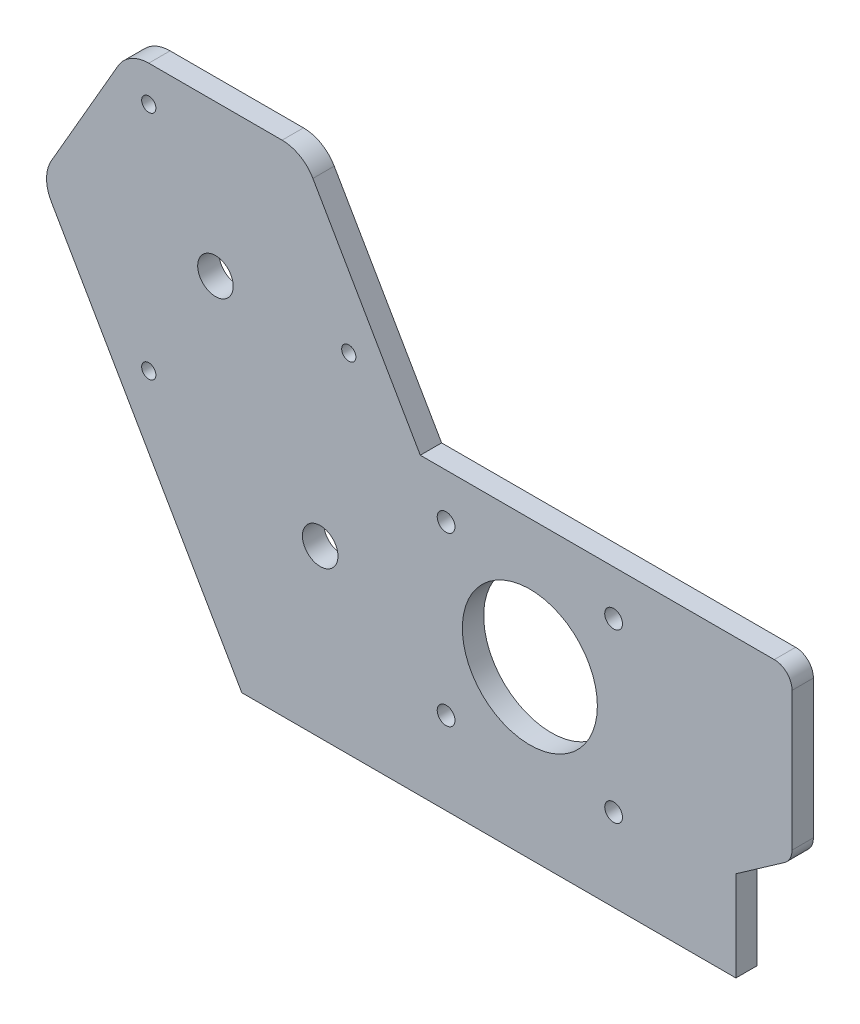
ISO-10303-21;
HEADER;
FILE_DESCRIPTION(('STEP AP214'),'2;1');
FILE_NAME('part.step','',(''),(''),'','','');
FILE_SCHEMA(('AUTOMOTIVE_DESIGN { 1 0 10303 214 1 1 1 1 }'));
ENDSEC;
DATA;
#1=APPLICATION_CONTEXT('core data for automotive mechanical design processes');
#2=APPLICATION_PROTOCOL_DEFINITION('international standard','automotive_design',2000,#1);
#3=PRODUCT_CONTEXT('',#1,'mechanical');
#4=PRODUCT('Part','Part','',(#3));
#5=PRODUCT_RELATED_PRODUCT_CATEGORY('part','',(#4));
#6=PRODUCT_DEFINITION_FORMATION('','',#4);
#7=PRODUCT_DEFINITION_CONTEXT('part definition',#1,'design');
#8=PRODUCT_DEFINITION('design','',#6,#7);
#9=PRODUCT_DEFINITION_SHAPE('','',#8);
#10=(LENGTH_UNIT() NAMED_UNIT(*) SI_UNIT(.MILLI.,.METRE.));
#11=(NAMED_UNIT(*) PLANE_ANGLE_UNIT() SI_UNIT($,.RADIAN.));
#12=(NAMED_UNIT(*) SI_UNIT($,.STERADIAN.) SOLID_ANGLE_UNIT());
#13=UNCERTAINTY_MEASURE_WITH_UNIT(LENGTH_MEASURE(1.E-05),#10,'distance_accuracy_value','');
#14=(GEOMETRIC_REPRESENTATION_CONTEXT(3) GLOBAL_UNCERTAINTY_ASSIGNED_CONTEXT((#13)) GLOBAL_UNIT_ASSIGNED_CONTEXT((#10,
#11,#12)) REPRESENTATION_CONTEXT('',''));
#15=CARTESIAN_POINT('',(0.,0.,0.));
#16=DIRECTION('',(0.,0.,1.));
#17=DIRECTION('',(1.,0.,0.));
#18=AXIS2_PLACEMENT_3D('',#15,#16,#17);
#19=CARTESIAN_POINT('',(80.7999999999998,61.066114356479,6.));
#20=DIRECTION('',(0.,0.,1.));
#21=DIRECTION('',(1.,0.,0.));
#22=AXIS2_PLACEMENT_3D('',#19,#20,#21);
#23=PLANE('',#22);
#24=CARTESIAN_POINT('',(-76.4646277765312,119.845498823314,6.));
#25=DIRECTION('',(0.,0.,1.));
#26=DIRECTION('',(1.,0.,0.));
#27=AXIS2_PLACEMENT_3D('',#24,#25,#26);
#28=CIRCLE('',#27,5.0000000000103);
#29=CARTESIAN_POINT('',(-71.4646277765209,119.845498823314,6.));
#30=VERTEX_POINT('',#29);
#31=EDGE_CURVE('E392',#30,#30,#28,.T.);
#32=ORIENTED_EDGE('',*,*,#31,.F.);
#33=EDGE_LOOP('',(#32));
#34=FACE_BOUND('',#33,.T.);
#35=CARTESIAN_POINT('',(-38.9368602792078,119.84549882328,6.));
#36=DIRECTION('',(0.,0.,1.));
#37=DIRECTION('',(1.,0.,0.));
#38=AXIS2_PLACEMENT_3D('',#35,#36,#37);
#39=CIRCLE('',#38,2.00000000002159);
#40=CARTESIAN_POINT('',(-36.9368602791863,119.84549882328,6.));
#41=VERTEX_POINT('',#40);
#42=EDGE_CURVE('E408',#41,#41,#39,.T.);
#43=ORIENTED_EDGE('',*,*,#42,.F.);
#44=EDGE_LOOP('',(#43));
#45=FACE_BOUND('',#44,.T.);
#46=CARTESIAN_POINT('',(-11.5577217872792,92.36,6.));
#47=DIRECTION('',(0.,0.,1.));
#48=DIRECTION('',(1.,0.,0.));
#49=AXIS2_PLACEMENT_3D('',#46,#47,#48);
#50=CIRCLE('',#49,2.5);
#51=CARTESIAN_POINT('',(-9.05772178727923,92.36,6.));
#52=VERTEX_POINT('',#51);
#53=EDGE_CURVE('E424',#52,#52,#50,.T.);
#54=ORIENTED_EDGE('',*,*,#53,.F.);
#55=EDGE_LOOP('',(#54));
#56=FACE_BOUND('',#55,.T.);
#57=CARTESIAN_POINT('',(35.5822782127208,92.36,6.));
#58=DIRECTION('',(0.,0.,1.));
#59=DIRECTION('',(1.,0.,0.));
#60=AXIS2_PLACEMENT_3D('',#57,#58,#59);
#61=CIRCLE('',#60,2.5);
#62=CARTESIAN_POINT('',(38.0822782127208,92.36,6.));
#63=VERTEX_POINT('',#62);
#64=EDGE_CURVE('E440',#63,#63,#61,.T.);
#65=ORIENTED_EDGE('',*,*,#64,.F.);
#66=EDGE_LOOP('',(#65));
#67=FACE_BOUND('',#66,.T.);
#68=CARTESIAN_POINT('',(-11.5577217872793,45.22,6.));
#69=DIRECTION('',(0.,0.,1.));
#70=DIRECTION('',(1.,0.,0.));
#71=AXIS2_PLACEMENT_3D('',#68,#69,#70);
#72=CIRCLE('',#71,2.5);
#73=CARTESIAN_POINT('',(-9.05772178727925,45.22,6.));
#74=VERTEX_POINT('',#73);
#75=EDGE_CURVE('E186',#74,#74,#72,.T.);
#76=ORIENTED_EDGE('',*,*,#75,.F.);
#77=EDGE_LOOP('',(#76));
#78=FACE_BOUND('',#77,.T.);
#79=DIRECTION('',(0.499999999999923,-0.866025403784483,0.));
#80=VECTOR('',#79,1.);
#81=CARTESIAN_POINT('',(-122.652649311673,114.845498823294,6.));
#82=LINE('',#81,#80);
#83=CARTESIAN_POINT('',(-122.652649311673,114.845498823294,6.));
#84=VERTEX_POINT('',#83);
#85=CARTESIAN_POINT('',(-69.04827557302,22.000000000017,6.));
#86=VERTEX_POINT('',#85);
#87=EDGE_CURVE('E222',#84,#86,#82,.T.);
#88=ORIENTED_EDGE('',*,*,#87,.T.);
#89=DIRECTION('',(1.,0.,0.));
#90=VECTOR('',#89,1.);
#91=CARTESIAN_POINT('',(-69.04827557302,22.000000000017,6.));
#92=LINE('',#91,#90);
#93=CARTESIAN_POINT('',(69.9999999999999,22.000000000017,6.));
#94=VERTEX_POINT('',#93);
#95=EDGE_CURVE('E122',#86,#94,#92,.T.);
#96=ORIENTED_EDGE('',*,*,#95,.T.);
#97=DIRECTION('',(0.,1.,0.));
#98=VECTOR('',#97,1.);
#99=CARTESIAN_POINT('',(69.9999999999999,22.000000000017,6.));
#100=LINE('',#99,#98);
#101=CARTESIAN_POINT('',(69.9999999999999,47.4000000000069,6.));
#102=VERTEX_POINT('',#101);
#103=EDGE_CURVE('E267',#94,#102,#100,.T.);
#104=ORIENTED_EDGE('',*,*,#103,.T.);
#105=DIRECTION('',(0.81915204428899,0.573576436351048,0.));
#106=VECTOR('',#105,1.);
#107=CARTESIAN_POINT('',(69.9999999999999,47.4000000000069,6.));
#108=LINE('',#107,#106);
#109=CARTESIAN_POINT('',(83.667882181755,56.970354135034,6.));
#110=VERTEX_POINT('',#109);
#111=EDGE_CURVE('E287',#102,#110,#108,.T.);
#112=ORIENTED_EDGE('',*,*,#111,.T.);
#113=CARTESIAN_POINT('',(80.7999999999998,61.066114356479,6.));
#114=DIRECTION('',(0.,0.,1.));
#115=DIRECTION('',(1.,0.,0.));
#116=AXIS2_PLACEMENT_3D('',#113,#114,#115);
#117=CIRCLE('',#116,5.00000000000002);
#118=CARTESIAN_POINT('',(85.7999999999998,61.066114356479,6.));
#119=VERTEX_POINT('',#118);
#120=EDGE_CURVE('E283',#110,#119,#117,.T.);
#121=ORIENTED_EDGE('',*,*,#120,.T.);
#122=DIRECTION('',(0.,1.,0.));
#123=VECTOR('',#122,1.);
#124=CARTESIAN_POINT('',(85.7999999999998,61.066114356479,6.));
#125=LINE('',#124,#123);
#126=CARTESIAN_POINT('',(85.7999999999998,100.000000000007,6.));
#127=VERTEX_POINT('',#126);
#128=EDGE_CURVE('E286',#119,#127,#125,.T.);
#129=ORIENTED_EDGE('',*,*,#128,.T.);
#130=CARTESIAN_POINT('',(80.7999999999997,100.000000000007,6.));
#131=DIRECTION('',(0.,0.,1.));
#132=DIRECTION('',(1.,0.,0.));
#133=AXIS2_PLACEMENT_3D('',#130,#131,#132);
#134=CIRCLE('',#133,5.00000000000006);
#135=CARTESIAN_POINT('',(80.7999999999997,105.000000000007,6.));
#136=VERTEX_POINT('',#135);
#137=EDGE_CURVE('E291',#127,#136,#134,.T.);
#138=ORIENTED_EDGE('',*,*,#137,.T.);
#139=DIRECTION('',(-1.,0.,0.));
#140=VECTOR('',#139,1.);
#141=CARTESIAN_POINT('',(-18.8188021535173,105.000000000007,6.));
#142=LINE('',#141,#140);
#143=CARTESIAN_POINT('',(-18.8188021535173,105.000000000007,6.));
#144=VERTEX_POINT('',#143);
#145=EDGE_CURVE('E298',#136,#144,#142,.T.);
#146=ORIENTED_EDGE('',*,*,#145,.T.);
#147=DIRECTION('',(-0.499999999999924,0.866025403784483,0.));
#148=VECTOR('',#147,1.);
#149=CARTESIAN_POINT('',(-18.8188021535173,105.000000000007,6.));
#150=LINE('',#149,#148);
#151=CARTESIAN_POINT('',(-49.0404899899995,157.345498823291,6.));
#152=VERTEX_POINT('',#151);
#153=EDGE_CURVE('E301',#144,#152,#150,.T.);
#154=ORIENTED_EDGE('',*,*,#153,.T.);
#155=CARTESIAN_POINT('',(-57.7007440278445,152.345498823292,6.));
#156=DIRECTION('',(0.,0.,1.));
#157=DIRECTION('',(1.,0.,0.));
#158=AXIS2_PLACEMENT_3D('',#155,#156,#157);
#159=CIRCLE('',#158,10.0000000000001);
#160=CARTESIAN_POINT('',(-57.7007440278459,162.345498823292,6.));
#161=VERTEX_POINT('',#160);
#162=EDGE_CURVE('E304',#152,#161,#159,.T.);
#163=ORIENTED_EDGE('',*,*,#162,.T.);
#164=DIRECTION('',(-1.,-1.55316216977134E-13,0.));
#165=VECTOR('',#164,1.);
#166=CARTESIAN_POINT('',(-57.7007440278459,162.345498823292,6.));
#167=LINE('',#166,#165);
#168=CARTESIAN_POINT('',(-95.2285115251715,162.345498823286,6.));
#169=VERTEX_POINT('',#168);
#170=EDGE_CURVE('E159',#161,#169,#167,.T.);
#171=ORIENTED_EDGE('',*,*,#170,.T.);
#172=CARTESIAN_POINT('',(-95.22851152517,152.345498823308,6.));
#173=DIRECTION('',(0.,0.,1.));
#174=DIRECTION('',(1.,0.,0.));
#175=AXIS2_PLACEMENT_3D('',#172,#173,#174);
#176=CIRCLE('',#175,9.99999999997799);
#177=CARTESIAN_POINT('',(-103.888765562993,157.345498823301,6.));
#178=VERTEX_POINT('',#177);
#179=EDGE_CURVE('E153',#169,#178,#176,.T.);
#180=ORIENTED_EDGE('',*,*,#179,.T.);
#181=DIRECTION('',(-0.500000000000381,-0.866025403784218,0.));
#182=VECTOR('',#181,1.);
#183=CARTESIAN_POINT('',(-103.888765562993,157.345498823301,6.));
#184=LINE('',#183,#182);
#185=CARTESIAN_POINT('',(-122.65264931167,124.845498823309,6.));
#186=VERTEX_POINT('',#185);
#187=EDGE_CURVE('E157',#178,#186,#184,.T.);
#188=ORIENTED_EDGE('',*,*,#187,.T.);
#189=CARTESIAN_POINT('',(-113.992395273818,119.845498823299,6.));
#190=DIRECTION('',(0.,0.,1.));
#191=DIRECTION('',(1.,0.,0.));
#192=AXIS2_PLACEMENT_3D('',#189,#190,#191);
#193=CIRCLE('',#192,10.0000000000121);
#194=EDGE_CURVE('E61',#186,#84,#193,.T.);
#195=ORIENTED_EDGE('',*,*,#194,.T.);
#196=EDGE_LOOP('',(#88,#96,#104,#112,#121,#129,#138,#146,#154,#163,#171,#180,#188,#195));
#197=FACE_BOUND('',#196,.T.);
#198=CARTESIAN_POINT('',(35.5822782127208,45.22,6.));
#199=DIRECTION('',(0.,0.,1.));
#200=DIRECTION('',(1.,0.,0.));
#201=AXIS2_PLACEMENT_3D('',#198,#199,#200);
#202=CIRCLE('',#201,2.5);
#203=CARTESIAN_POINT('',(38.0822782127208,45.22,6.));
#204=VERTEX_POINT('',#203);
#205=EDGE_CURVE('E448',#204,#204,#202,.T.);
#206=ORIENTED_EDGE('',*,*,#205,.F.);
#207=EDGE_LOOP('',(#206));
#208=FACE_BOUND('',#207,.T.);
#209=CARTESIAN_POINT('',(12.012278212721,68.79,6.));
#210=DIRECTION('',(0.,0.,1.));
#211=DIRECTION('',(1.,0.,0.));
#212=AXIS2_PLACEMENT_3D('',#209,#210,#211);
#213=CIRCLE('',#212,19.0000000000001);
#214=CARTESIAN_POINT('',(31.0122782127211,68.79,6.));
#215=VERTEX_POINT('',#214);
#216=EDGE_CURVE('E432',#215,#215,#213,.T.);
#217=ORIENTED_EDGE('',*,*,#216,.F.);
#218=EDGE_LOOP('',(#217));
#219=FACE_BOUND('',#218,.T.);
#220=CARTESIAN_POINT('',(-46.9877217872786,68.79,6.));
#221=DIRECTION('',(0.,0.,1.));
#222=DIRECTION('',(1.,0.,0.));
#223=AXIS2_PLACEMENT_3D('',#220,#221,#222);
#224=CIRCLE('',#223,5.00000000000003);
#225=CARTESIAN_POINT('',(-41.9877217872786,68.79,6.));
#226=VERTEX_POINT('',#225);
#227=EDGE_CURVE('E416',#226,#226,#224,.T.);
#228=ORIENTED_EDGE('',*,*,#227,.F.);
#229=EDGE_LOOP('',(#228));
#230=FACE_BOUND('',#229,.T.);
#231=CARTESIAN_POINT('',(-95.2285115252254,87.3454988233333,6.));
#232=DIRECTION('',(0.,0.,1.));
#233=DIRECTION('',(1.,0.,0.));
#234=AXIS2_PLACEMENT_3D('',#231,#232,#233);
#235=CIRCLE('',#234,2.00000000003525);
#236=CARTESIAN_POINT('',(-93.2285115251901,87.3454988233333,6.));
#237=VERTEX_POINT('',#236);
#238=EDGE_CURVE('E400',#237,#237,#235,.T.);
#239=ORIENTED_EDGE('',*,*,#238,.F.);
#240=EDGE_LOOP('',(#239));
#241=FACE_BOUND('',#240,.T.);
#242=CARTESIAN_POINT('',(-95.2285115251634,152.345498823335,6.));
#243=DIRECTION('',(0.,0.,1.));
#244=DIRECTION('',(1.,0.,0.));
#245=AXIS2_PLACEMENT_3D('',#242,#243,#244);
#246=CIRCLE('',#245,1.99999999997524);
#247=CARTESIAN_POINT('',(-93.2285115251881,152.345498823335,6.));
#248=VERTEX_POINT('',#247);
#249=EDGE_CURVE('E381',#248,#248,#246,.T.);
#250=ORIENTED_EDGE('',*,*,#249,.F.);
#251=EDGE_LOOP('',(#250));
#252=FACE_BOUND('',#251,.T.);
#253=ADVANCED_FACE('F43',(#34,#45,#56,#67,#78,#197,#208,#219,#230,#241,#252),#23,.T.);
#254=CARTESIAN_POINT('',(80.7999999999998,61.066114356479,0.));
#255=DIRECTION('',(0.,0.,1.));
#256=DIRECTION('',(1.,0.,0.));
#257=AXIS2_PLACEMENT_3D('',#254,#255,#256);
#258=PLANE('',#257);
#259=DIRECTION('',(0.499999999999923,-0.866025403784483,0.));
#260=VECTOR('',#259,1.);
#261=CARTESIAN_POINT('',(-122.652649311673,114.845498823294,0.));
#262=LINE('',#261,#260);
#263=CARTESIAN_POINT('',(-122.652649311673,114.845498823294,0.));
#264=VERTEX_POINT('',#263);
#265=CARTESIAN_POINT('',(-69.04827557302,22.000000000017,0.));
#266=VERTEX_POINT('',#265);
#267=EDGE_CURVE('E181',#264,#266,#262,.T.);
#268=ORIENTED_EDGE('',*,*,#267,.F.);
#269=CARTESIAN_POINT('',(-113.992395273818,119.845498823299,0.));
#270=DIRECTION('',(0.,0.,1.));
#271=DIRECTION('',(1.,0.,0.));
#272=AXIS2_PLACEMENT_3D('',#269,#270,#271);
#273=CIRCLE('',#272,10.0000000000121);
#274=CARTESIAN_POINT('',(-122.65264931167,124.845498823309,0.));
#275=VERTEX_POINT('',#274);
#276=EDGE_CURVE('E114',#275,#264,#273,.T.);
#277=ORIENTED_EDGE('',*,*,#276,.F.);
#278=DIRECTION('',(-0.500000000000381,-0.866025403784218,0.));
#279=VECTOR('',#278,1.);
#280=CARTESIAN_POINT('',(-103.888765562993,157.345498823301,0.));
#281=LINE('',#280,#279);
#282=CARTESIAN_POINT('',(-103.888765562993,157.345498823301,0.));
#283=VERTEX_POINT('',#282);
#284=EDGE_CURVE('E108',#283,#275,#281,.T.);
#285=ORIENTED_EDGE('',*,*,#284,.F.);
#286=CARTESIAN_POINT('',(-95.22851152517,152.345498823308,0.));
#287=DIRECTION('',(0.,0.,1.));
#288=DIRECTION('',(1.,0.,0.));
#289=AXIS2_PLACEMENT_3D('',#286,#287,#288);
#290=CIRCLE('',#289,9.99999999997799);
#291=CARTESIAN_POINT('',(-95.2285115251715,162.345498823286,0.));
#292=VERTEX_POINT('',#291);
#293=EDGE_CURVE('E168',#292,#283,#290,.T.);
#294=ORIENTED_EDGE('',*,*,#293,.F.);
#295=DIRECTION('',(-1.,-1.55316216977134E-13,0.));
#296=VECTOR('',#295,1.);
#297=CARTESIAN_POINT('',(-57.7007440278459,162.345498823292,0.));
#298=LINE('',#297,#296);
#299=CARTESIAN_POINT('',(-57.7007440278459,162.345498823292,0.));
#300=VERTEX_POINT('',#299);
#301=EDGE_CURVE('E213',#300,#292,#298,.T.);
#302=ORIENTED_EDGE('',*,*,#301,.F.);
#303=CARTESIAN_POINT('',(-57.7007440278445,152.345498823292,0.));
#304=DIRECTION('',(0.,0.,1.));
#305=DIRECTION('',(1.,0.,0.));
#306=AXIS2_PLACEMENT_3D('',#303,#304,#305);
#307=CIRCLE('',#306,10.0000000000001);
#308=CARTESIAN_POINT('',(-49.0404899899995,157.345498823291,0.));
#309=VERTEX_POINT('',#308);
#310=EDGE_CURVE('E210',#309,#300,#307,.T.);
#311=ORIENTED_EDGE('',*,*,#310,.F.);
#312=DIRECTION('',(-0.499999999999924,0.866025403784483,0.));
#313=VECTOR('',#312,1.);
#314=CARTESIAN_POINT('',(-18.8188021535173,105.000000000007,0.));
#315=LINE('',#314,#313);
#316=CARTESIAN_POINT('',(-18.8188021535173,105.000000000007,0.));
#317=VERTEX_POINT('',#316);
#318=EDGE_CURVE('E207',#317,#309,#315,.T.);
#319=ORIENTED_EDGE('',*,*,#318,.F.);
#320=DIRECTION('',(-1.,0.,0.));
#321=VECTOR('',#320,1.);
#322=CARTESIAN_POINT('',(-18.8188021535173,105.000000000007,0.));
#323=LINE('',#322,#321);
#324=CARTESIAN_POINT('',(80.7999999999997,105.000000000007,0.));
#325=VERTEX_POINT('',#324);
#326=EDGE_CURVE('E204',#325,#317,#323,.T.);
#327=ORIENTED_EDGE('',*,*,#326,.F.);
#328=CARTESIAN_POINT('',(80.7999999999997,100.000000000007,0.));
#329=DIRECTION('',(0.,0.,1.));
#330=DIRECTION('',(1.,0.,0.));
#331=AXIS2_PLACEMENT_3D('',#328,#329,#330);
#332=CIRCLE('',#331,5.00000000000006);
#333=CARTESIAN_POINT('',(85.7999999999998,100.000000000007,0.));
#334=VERTEX_POINT('',#333);
#335=EDGE_CURVE('E201',#334,#325,#332,.T.);
#336=ORIENTED_EDGE('',*,*,#335,.F.);
#337=DIRECTION('',(0.,1.,0.));
#338=VECTOR('',#337,1.);
#339=CARTESIAN_POINT('',(85.7999999999998,61.066114356479,0.));
#340=LINE('',#339,#338);
#341=CARTESIAN_POINT('',(85.7999999999998,61.066114356479,0.));
#342=VERTEX_POINT('',#341);
#343=EDGE_CURVE('E198',#342,#334,#340,.T.);
#344=ORIENTED_EDGE('',*,*,#343,.F.);
#345=CARTESIAN_POINT('',(80.7999999999998,61.066114356479,0.));
#346=DIRECTION('',(0.,0.,1.));
#347=DIRECTION('',(1.,0.,0.));
#348=AXIS2_PLACEMENT_3D('',#345,#346,#347);
#349=CIRCLE('',#348,5.00000000000002);
#350=CARTESIAN_POINT('',(83.667882181755,56.970354135034,0.));
#351=VERTEX_POINT('',#350);
#352=EDGE_CURVE('E195',#351,#342,#349,.T.);
#353=ORIENTED_EDGE('',*,*,#352,.F.);
#354=DIRECTION('',(0.81915204428899,0.573576436351048,0.));
#355=VECTOR('',#354,1.);
#356=CARTESIAN_POINT('',(69.9999999999999,47.4000000000069,0.));
#357=LINE('',#356,#355);
#358=CARTESIAN_POINT('',(69.9999999999999,47.4000000000069,0.));
#359=VERTEX_POINT('',#358);
#360=EDGE_CURVE('E192',#359,#351,#357,.T.);
#361=ORIENTED_EDGE('',*,*,#360,.F.);
#362=DIRECTION('',(0.,1.,0.));
#363=VECTOR('',#362,1.);
#364=CARTESIAN_POINT('',(69.9999999999999,22.000000000017,0.));
#365=LINE('',#364,#363);
#366=CARTESIAN_POINT('',(69.9999999999999,22.000000000017,0.));
#367=VERTEX_POINT('',#366);
#368=EDGE_CURVE('E189',#367,#359,#365,.T.);
#369=ORIENTED_EDGE('',*,*,#368,.F.);
#370=DIRECTION('',(1.,0.,0.));
#371=VECTOR('',#370,1.);
#372=CARTESIAN_POINT('',(-69.04827557302,22.000000000017,0.));
#373=LINE('',#372,#371);
#374=EDGE_CURVE('E185',#266,#367,#373,.T.);
#375=ORIENTED_EDGE('',*,*,#374,.F.);
#376=EDGE_LOOP('',(#268,#277,#285,#294,#302,#311,#319,#327,#336,#344,#353,#361,#369,#375));
#377=FACE_BOUND('',#376,.T.);
#378=CARTESIAN_POINT('',(-11.5577217872793,45.22,0.));
#379=DIRECTION('',(0.,0.,1.));
#380=DIRECTION('',(1.,0.,0.));
#381=AXIS2_PLACEMENT_3D('',#378,#379,#380);
#382=CIRCLE('',#381,2.5);
#383=CARTESIAN_POINT('',(-9.05772178727925,45.22,0.));
#384=VERTEX_POINT('',#383);
#385=EDGE_CURVE('E452',#384,#384,#382,.T.);
#386=ORIENTED_EDGE('',*,*,#385,.T.);
#387=EDGE_LOOP('',(#386));
#388=FACE_BOUND('',#387,.T.);
#389=CARTESIAN_POINT('',(35.5822782127208,45.22,0.));
#390=DIRECTION('',(0.,0.,1.));
#391=DIRECTION('',(1.,0.,0.));
#392=AXIS2_PLACEMENT_3D('',#389,#390,#391);
#393=CIRCLE('',#392,2.5);
#394=CARTESIAN_POINT('',(38.0822782127208,45.22,0.));
#395=VERTEX_POINT('',#394);
#396=EDGE_CURVE('E444',#395,#395,#393,.T.);
#397=ORIENTED_EDGE('',*,*,#396,.T.);
#398=EDGE_LOOP('',(#397));
#399=FACE_BOUND('',#398,.T.);
#400=CARTESIAN_POINT('',(35.5822782127208,92.36,0.));
#401=DIRECTION('',(0.,0.,1.));
#402=DIRECTION('',(1.,0.,0.));
#403=AXIS2_PLACEMENT_3D('',#400,#401,#402);
#404=CIRCLE('',#403,2.5);
#405=CARTESIAN_POINT('',(38.0822782127208,92.36,0.));
#406=VERTEX_POINT('',#405);
#407=EDGE_CURVE('E436',#406,#406,#404,.T.);
#408=ORIENTED_EDGE('',*,*,#407,.T.);
#409=EDGE_LOOP('',(#408));
#410=FACE_BOUND('',#409,.T.);
#411=CARTESIAN_POINT('',(12.012278212721,68.79,0.));
#412=DIRECTION('',(0.,0.,1.));
#413=DIRECTION('',(1.,0.,0.));
#414=AXIS2_PLACEMENT_3D('',#411,#412,#413);
#415=CIRCLE('',#414,19.0000000000001);
#416=CARTESIAN_POINT('',(31.0122782127211,68.79,0.));
#417=VERTEX_POINT('',#416);
#418=EDGE_CURVE('E428',#417,#417,#415,.T.);
#419=ORIENTED_EDGE('',*,*,#418,.T.);
#420=EDGE_LOOP('',(#419));
#421=FACE_BOUND('',#420,.T.);
#422=CARTESIAN_POINT('',(-11.5577217872792,92.36,0.));
#423=DIRECTION('',(0.,0.,1.));
#424=DIRECTION('',(1.,0.,0.));
#425=AXIS2_PLACEMENT_3D('',#422,#423,#424);
#426=CIRCLE('',#425,2.5);
#427=CARTESIAN_POINT('',(-9.05772178727923,92.36,0.));
#428=VERTEX_POINT('',#427);
#429=EDGE_CURVE('E420',#428,#428,#426,.T.);
#430=ORIENTED_EDGE('',*,*,#429,.T.);
#431=EDGE_LOOP('',(#430));
#432=FACE_BOUND('',#431,.T.);
#433=CARTESIAN_POINT('',(-46.9877217872786,68.79,0.));
#434=DIRECTION('',(0.,0.,1.));
#435=DIRECTION('',(1.,0.,0.));
#436=AXIS2_PLACEMENT_3D('',#433,#434,#435);
#437=CIRCLE('',#436,5.00000000000003);
#438=CARTESIAN_POINT('',(-41.9877217872786,68.79,0.));
#439=VERTEX_POINT('',#438);
#440=EDGE_CURVE('E412',#439,#439,#437,.T.);
#441=ORIENTED_EDGE('',*,*,#440,.T.);
#442=EDGE_LOOP('',(#441));
#443=FACE_BOUND('',#442,.T.);
#444=CARTESIAN_POINT('',(-38.9368602792078,119.84549882328,0.));
#445=DIRECTION('',(0.,0.,1.));
#446=DIRECTION('',(1.,0.,0.));
#447=AXIS2_PLACEMENT_3D('',#444,#445,#446);
#448=CIRCLE('',#447,2.00000000002159);
#449=CARTESIAN_POINT('',(-36.9368602791863,119.84549882328,0.));
#450=VERTEX_POINT('',#449);
#451=EDGE_CURVE('E404',#450,#450,#448,.T.);
#452=ORIENTED_EDGE('',*,*,#451,.T.);
#453=EDGE_LOOP('',(#452));
#454=FACE_BOUND('',#453,.T.);
#455=CARTESIAN_POINT('',(-95.2285115252254,87.3454988233333,0.));
#456=DIRECTION('',(0.,0.,1.));
#457=DIRECTION('',(1.,0.,0.));
#458=AXIS2_PLACEMENT_3D('',#455,#456,#457);
#459=CIRCLE('',#458,2.00000000003525);
#460=CARTESIAN_POINT('',(-93.2285115251901,87.3454988233333,0.));
#461=VERTEX_POINT('',#460);
#462=EDGE_CURVE('E396',#461,#461,#459,.T.);
#463=ORIENTED_EDGE('',*,*,#462,.T.);
#464=EDGE_LOOP('',(#463));
#465=FACE_BOUND('',#464,.T.);
#466=CARTESIAN_POINT('',(-76.4646277765312,119.845498823314,0.));
#467=DIRECTION('',(0.,0.,1.));
#468=DIRECTION('',(1.,0.,0.));
#469=AXIS2_PLACEMENT_3D('',#466,#467,#468);
#470=CIRCLE('',#469,5.0000000000103);
#471=CARTESIAN_POINT('',(-71.4646277765209,119.845498823314,0.));
#472=VERTEX_POINT('',#471);
#473=EDGE_CURVE('E389',#472,#472,#470,.T.);
#474=ORIENTED_EDGE('',*,*,#473,.T.);
#475=EDGE_LOOP('',(#474));
#476=FACE_BOUND('',#475,.T.);
#477=CARTESIAN_POINT('',(-95.2285115251634,152.345498823335,0.));
#478=DIRECTION('',(0.,0.,1.));
#479=DIRECTION('',(1.,0.,0.));
#480=AXIS2_PLACEMENT_3D('',#477,#478,#479);
#481=CIRCLE('',#480,1.99999999997524);
#482=CARTESIAN_POINT('',(-93.2285115251881,152.345498823335,0.));
#483=VERTEX_POINT('',#482);
#484=EDGE_CURVE('E384',#483,#483,#481,.T.);
#485=ORIENTED_EDGE('',*,*,#484,.T.);
#486=EDGE_LOOP('',(#485));
#487=FACE_BOUND('',#486,.T.);
#488=ADVANCED_FACE('F271',(#377,#388,#399,#410,#421,#432,#443,#454,#465,#476,#487),#258,.F.);
#489=CARTESIAN_POINT('',(-122.652649311673,114.845498823294,6.));
#490=DIRECTION('',(0.866025403784483,0.499999999999923,0.));
#491=DIRECTION('',(-0.499999999999923,0.866025403784483,0.));
#492=AXIS2_PLACEMENT_3D('',#489,#490,#491);
#493=PLANE('',#492);
#494=ORIENTED_EDGE('',*,*,#267,.T.);
#495=DIRECTION('',(0.,0.,-1.));
#496=VECTOR('',#495,1.);
#497=CARTESIAN_POINT('',(-69.04827557302,22.000000000017,6.));
#498=LINE('',#497,#496);
#499=EDGE_CURVE('E11',#86,#266,#498,.T.);
#500=ORIENTED_EDGE('',*,*,#499,.F.);
#501=ORIENTED_EDGE('',*,*,#87,.F.);
#502=DIRECTION('',(0.,0.,-1.));
#503=VECTOR('',#502,1.);
#504=CARTESIAN_POINT('',(-122.652649311673,114.845498823294,6.));
#505=LINE('',#504,#503);
#506=EDGE_CURVE('E177',#84,#264,#505,.T.);
#507=ORIENTED_EDGE('',*,*,#506,.T.);
#508=EDGE_LOOP('',(#494,#500,#501,#507));
#509=FACE_BOUND('',#508,.T.);
#510=ADVANCED_FACE('F45',(#509),#493,.F.);
#511=CARTESIAN_POINT('',(-69.04827557302,22.000000000017,6.));
#512=DIRECTION('',(0.,1.,0.));
#513=DIRECTION('',(-1.,0.,0.));
#514=AXIS2_PLACEMENT_3D('',#511,#512,#513);
#515=PLANE('',#514);
#516=ORIENTED_EDGE('',*,*,#374,.T.);
#517=DIRECTION('',(0.,0.,-1.));
#518=VECTOR('',#517,1.);
#519=CARTESIAN_POINT('',(69.9999999999999,22.000000000017,6.));
#520=LINE('',#519,#518);
#521=EDGE_CURVE('E53',#94,#367,#520,.T.);
#522=ORIENTED_EDGE('',*,*,#521,.F.);
#523=ORIENTED_EDGE('',*,*,#95,.F.);
#524=ORIENTED_EDGE('',*,*,#499,.T.);
#525=EDGE_LOOP('',(#516,#522,#523,#524));
#526=FACE_BOUND('',#525,.T.);
#527=ADVANCED_FACE('F654',(#526),#515,.F.);
#528=CARTESIAN_POINT('',(69.9999999999999,22.000000000017,6.));
#529=DIRECTION('',(-1.,0.,0.));
#530=DIRECTION('',(0.,-1.,0.));
#531=AXIS2_PLACEMENT_3D('',#528,#529,#530);
#532=PLANE('',#531);
#533=ORIENTED_EDGE('',*,*,#368,.T.);
#534=DIRECTION('',(0.,0.,-1.));
#535=VECTOR('',#534,1.);
#536=CARTESIAN_POINT('',(69.9999999999999,47.4000000000069,6.));
#537=LINE('',#536,#535);
#538=EDGE_CURVE('E257',#102,#359,#537,.T.);
#539=ORIENTED_EDGE('',*,*,#538,.F.);
#540=ORIENTED_EDGE('',*,*,#103,.F.);
#541=ORIENTED_EDGE('',*,*,#521,.T.);
#542=EDGE_LOOP('',(#533,#539,#540,#541));
#543=FACE_BOUND('',#542,.T.);
#544=ADVANCED_FACE('F265',(#543),#532,.F.);
#545=CARTESIAN_POINT('',(69.9999999999999,47.4000000000069,6.));
#546=DIRECTION('',(-0.573576436351048,0.81915204428899,0.));
#547=DIRECTION('',(-0.81915204428899,-0.573576436351048,0.));
#548=AXIS2_PLACEMENT_3D('',#545,#546,#547);
#549=PLANE('',#548);
#550=ORIENTED_EDGE('',*,*,#360,.T.);
#551=DIRECTION('',(0.,0.,-1.));
#552=VECTOR('',#551,1.);
#553=CARTESIAN_POINT('',(83.667882181755,56.970354135034,6.));
#554=LINE('',#553,#552);
#555=EDGE_CURVE('E253',#110,#351,#554,.T.);
#556=ORIENTED_EDGE('',*,*,#555,.F.);
#557=ORIENTED_EDGE('',*,*,#111,.F.);
#558=ORIENTED_EDGE('',*,*,#538,.T.);
#559=EDGE_LOOP('',(#550,#556,#557,#558));
#560=FACE_BOUND('',#559,.T.);
#561=ADVANCED_FACE('F277',(#560),#549,.F.);
#562=CARTESIAN_POINT('',(80.7999999999998,61.066114356479,6.));
#563=DIRECTION('',(0.,0.,-1.));
#564=DIRECTION('',(-1.,0.,0.));
#565=AXIS2_PLACEMENT_3D('',#562,#563,#564);
#566=CYLINDRICAL_SURFACE('',#565,5.00000000000002);
#567=ORIENTED_EDGE('',*,*,#352,.T.);
#568=DIRECTION('',(0.,0.,-1.));
#569=VECTOR('',#568,1.);
#570=CARTESIAN_POINT('',(85.7999999999998,61.066114356479,6.));
#571=LINE('',#570,#569);
#572=EDGE_CURVE('E249',#119,#342,#571,.T.);
#573=ORIENTED_EDGE('',*,*,#572,.F.);
#574=ORIENTED_EDGE('',*,*,#120,.F.);
#575=ORIENTED_EDGE('',*,*,#555,.T.);
#576=EDGE_LOOP('',(#567,#573,#574,#575));
#577=FACE_BOUND('',#576,.T.);
#578=ADVANCED_FACE('F281',(#577),#566,.T.);
#579=CARTESIAN_POINT('',(85.7999999999998,61.066114356479,6.));
#580=DIRECTION('',(-1.,0.,0.));
#581=DIRECTION('',(0.,0.,1.));
#582=AXIS2_PLACEMENT_3D('',#579,#580,#581);
#583=PLANE('',#582);
#584=ORIENTED_EDGE('',*,*,#343,.T.);
#585=DIRECTION('',(0.,0.,-1.));
#586=VECTOR('',#585,1.);
#587=CARTESIAN_POINT('',(85.7999999999998,100.000000000007,6.));
#588=LINE('',#587,#586);
#589=EDGE_CURVE('E245',#127,#334,#588,.T.);
#590=ORIENTED_EDGE('',*,*,#589,.F.);
#591=ORIENTED_EDGE('',*,*,#128,.F.);
#592=ORIENTED_EDGE('',*,*,#572,.T.);
#593=EDGE_LOOP('',(#584,#590,#591,#592));
#594=FACE_BOUND('',#593,.T.);
#595=ADVANCED_FACE('F615',(#594),#583,.F.);
#596=CARTESIAN_POINT('',(80.7999999999997,100.000000000007,6.));
#597=DIRECTION('',(0.,0.,-1.));
#598=DIRECTION('',(-1.,0.,0.));
#599=AXIS2_PLACEMENT_3D('',#596,#597,#598);
#600=CYLINDRICAL_SURFACE('',#599,5.00000000000006);
#601=ORIENTED_EDGE('',*,*,#335,.T.);
#602=DIRECTION('',(0.,0.,-1.));
#603=VECTOR('',#602,1.);
#604=CARTESIAN_POINT('',(80.7999999999997,105.000000000007,6.));
#605=LINE('',#604,#603);
#606=EDGE_CURVE('E241',#136,#325,#605,.T.);
#607=ORIENTED_EDGE('',*,*,#606,.F.);
#608=ORIENTED_EDGE('',*,*,#137,.F.);
#609=ORIENTED_EDGE('',*,*,#589,.T.);
#610=EDGE_LOOP('',(#601,#607,#608,#609));
#611=FACE_BOUND('',#610,.T.);
#612=ADVANCED_FACE('F604',(#611),#600,.T.);
#613=CARTESIAN_POINT('',(-18.8188021535173,105.000000000007,6.));
#614=DIRECTION('',(0.,-1.,0.));
#615=DIRECTION('',(1.,0.,0.));
#616=AXIS2_PLACEMENT_3D('',#613,#614,#615);
#617=PLANE('',#616);
#618=ORIENTED_EDGE('',*,*,#326,.T.);
#619=DIRECTION('',(0.,0.,-1.));
#620=VECTOR('',#619,1.);
#621=CARTESIAN_POINT('',(-18.8188021535173,105.000000000007,6.));
#622=LINE('',#621,#620);
#623=EDGE_CURVE('E237',#144,#317,#622,.T.);
#624=ORIENTED_EDGE('',*,*,#623,.F.);
#625=ORIENTED_EDGE('',*,*,#145,.F.);
#626=ORIENTED_EDGE('',*,*,#606,.T.);
#627=EDGE_LOOP('',(#618,#624,#625,#626));
#628=FACE_BOUND('',#627,.T.);
#629=ADVANCED_FACE('F593',(#628),#617,.F.);
#630=CARTESIAN_POINT('',(-18.8188021535173,105.000000000007,6.));
#631=DIRECTION('',(-0.866025403784483,-0.499999999999923,0.));
#632=DIRECTION('',(0.499999999999924,-0.866025403784483,0.));
#633=AXIS2_PLACEMENT_3D('',#630,#631,#632);
#634=PLANE('',#633);
#635=ORIENTED_EDGE('',*,*,#318,.T.);
#636=DIRECTION('',(0.,0.,-1.));
#637=VECTOR('',#636,1.);
#638=CARTESIAN_POINT('',(-49.0404899899995,157.345498823291,6.));
#639=LINE('',#638,#637);
#640=EDGE_CURVE('E233',#152,#309,#639,.T.);
#641=ORIENTED_EDGE('',*,*,#640,.F.);
#642=ORIENTED_EDGE('',*,*,#153,.F.);
#643=ORIENTED_EDGE('',*,*,#623,.T.);
#644=EDGE_LOOP('',(#635,#641,#642,#643));
#645=FACE_BOUND('',#644,.T.);
#646=ADVANCED_FACE('F583',(#645),#634,.F.);
#647=CARTESIAN_POINT('',(-57.7007440278445,152.345498823292,6.));
#648=DIRECTION('',(0.,0.,-1.));
#649=DIRECTION('',(-1.,0.,0.));
#650=AXIS2_PLACEMENT_3D('',#647,#648,#649);
#651=CYLINDRICAL_SURFACE('',#650,10.0000000000001);
#652=ORIENTED_EDGE('',*,*,#310,.T.);
#653=DIRECTION('',(0.,0.,-1.));
#654=VECTOR('',#653,1.);
#655=CARTESIAN_POINT('',(-57.7007440278459,162.345498823292,6.));
#656=LINE('',#655,#654);
#657=EDGE_CURVE('E229',#161,#300,#656,.T.);
#658=ORIENTED_EDGE('',*,*,#657,.F.);
#659=ORIENTED_EDGE('',*,*,#162,.F.);
#660=ORIENTED_EDGE('',*,*,#640,.T.);
#661=EDGE_LOOP('',(#652,#658,#659,#660));
#662=FACE_BOUND('',#661,.T.);
#663=ADVANCED_FACE('F312',(#662),#651,.T.);
#664=CARTESIAN_POINT('',(-57.7007440278459,162.345498823292,6.));
#665=DIRECTION('',(1.55316216977134E-13,-1.,0.));
#666=DIRECTION('',(1.,1.55316216977134E-13,0.));
#667=AXIS2_PLACEMENT_3D('',#664,#665,#666);
#668=PLANE('',#667);
#669=ORIENTED_EDGE('',*,*,#301,.T.);
#670=DIRECTION('',(0.,0.,-1.));
#671=VECTOR('',#670,1.);
#672=CARTESIAN_POINT('',(-95.2285115251715,162.345498823286,6.));
#673=LINE('',#672,#671);
#674=EDGE_CURVE('E170',#169,#292,#673,.T.);
#675=ORIENTED_EDGE('',*,*,#674,.F.);
#676=ORIENTED_EDGE('',*,*,#170,.F.);
#677=ORIENTED_EDGE('',*,*,#657,.T.);
#678=EDGE_LOOP('',(#669,#675,#676,#677));
#679=FACE_BOUND('',#678,.T.);
#680=ADVANCED_FACE('F316',(#679),#668,.F.);
#681=CARTESIAN_POINT('',(-95.22851152517,152.345498823308,6.));
#682=DIRECTION('',(0.,0.,-1.));
#683=DIRECTION('',(-1.,0.,0.));
#684=AXIS2_PLACEMENT_3D('',#681,#682,#683);
#685=CYLINDRICAL_SURFACE('',#684,9.99999999997799);
#686=ORIENTED_EDGE('',*,*,#293,.T.);
#687=DIRECTION('',(0.,0.,-1.));
#688=VECTOR('',#687,1.);
#689=CARTESIAN_POINT('',(-103.888765562993,157.345498823301,6.));
#690=LINE('',#689,#688);
#691=EDGE_CURVE('E165',#178,#283,#690,.T.);
#692=ORIENTED_EDGE('',*,*,#691,.F.);
#693=ORIENTED_EDGE('',*,*,#179,.F.);
#694=ORIENTED_EDGE('',*,*,#674,.T.);
#695=EDGE_LOOP('',(#686,#692,#693,#694));
#696=FACE_BOUND('',#695,.T.);
#697=ADVANCED_FACE('F166',(#696),#685,.T.);
#698=CARTESIAN_POINT('',(-103.888765562993,157.345498823301,6.));
#699=DIRECTION('',(0.866025403784218,-0.500000000000381,0.));
#700=DIRECTION('',(0.500000000000381,0.866025403784218,0.));
#701=AXIS2_PLACEMENT_3D('',#698,#699,#700);
#702=PLANE('',#701);
#703=ORIENTED_EDGE('',*,*,#284,.T.);
#704=DIRECTION('',(0.,0.,-1.));
#705=VECTOR('',#704,1.);
#706=CARTESIAN_POINT('',(-122.65264931167,124.845498823309,6.));
#707=LINE('',#706,#705);
#708=EDGE_CURVE('E171',#186,#275,#707,.T.);
#709=ORIENTED_EDGE('',*,*,#708,.F.);
#710=ORIENTED_EDGE('',*,*,#187,.F.);
#711=ORIENTED_EDGE('',*,*,#691,.T.);
#712=EDGE_LOOP('',(#703,#709,#710,#711));
#713=FACE_BOUND('',#712,.T.);
#714=ADVANCED_FACE('F173',(#713),#702,.F.);
#715=CARTESIAN_POINT('',(-113.992395273818,119.845498823299,6.));
#716=DIRECTION('',(0.,0.,-1.));
#717=DIRECTION('',(-1.,0.,0.));
#718=AXIS2_PLACEMENT_3D('',#715,#716,#717);
#719=CYLINDRICAL_SURFACE('',#718,10.0000000000121);
#720=ORIENTED_EDGE('',*,*,#276,.T.);
#721=ORIENTED_EDGE('',*,*,#506,.F.);
#722=ORIENTED_EDGE('',*,*,#194,.F.);
#723=ORIENTED_EDGE('',*,*,#708,.T.);
#724=EDGE_LOOP('',(#720,#721,#722,#723));
#725=FACE_BOUND('',#724,.T.);
#726=ADVANCED_FACE('F320',(#725),#719,.T.);
#727=CARTESIAN_POINT('',(-11.5577217872793,45.22,6.));
#728=DIRECTION('',(0.,0.,-1.));
#729=DIRECTION('',(-1.,0.,0.));
#730=AXIS2_PLACEMENT_3D('',#727,#728,#729);
#731=CYLINDRICAL_SURFACE('',#730,2.5);
#732=ORIENTED_EDGE('',*,*,#75,.T.);
#733=EDGE_LOOP('',(#732));
#734=FACE_BOUND('',#733,.T.);
#735=ORIENTED_EDGE('',*,*,#385,.F.);
#736=EDGE_LOOP('',(#735));
#737=FACE_BOUND('',#736,.T.);
#738=ADVANCED_FACE('F322',(#734,#737),#731,.F.);
#739=CARTESIAN_POINT('',(35.5822782127208,45.22,6.));
#740=DIRECTION('',(0.,0.,-1.));
#741=DIRECTION('',(-1.,0.,0.));
#742=AXIS2_PLACEMENT_3D('',#739,#740,#741);
#743=CYLINDRICAL_SURFACE('',#742,2.5);
#744=ORIENTED_EDGE('',*,*,#205,.T.);
#745=EDGE_LOOP('',(#744));
#746=FACE_BOUND('',#745,.T.);
#747=ORIENTED_EDGE('',*,*,#396,.F.);
#748=EDGE_LOOP('',(#747));
#749=FACE_BOUND('',#748,.T.);
#750=ADVANCED_FACE('F328',(#746,#749),#743,.F.);
#751=CARTESIAN_POINT('',(35.5822782127208,92.36,6.));
#752=DIRECTION('',(0.,0.,-1.));
#753=DIRECTION('',(-1.,0.,0.));
#754=AXIS2_PLACEMENT_3D('',#751,#752,#753);
#755=CYLINDRICAL_SURFACE('',#754,2.5);
#756=ORIENTED_EDGE('',*,*,#64,.T.);
#757=EDGE_LOOP('',(#756));
#758=FACE_BOUND('',#757,.T.);
#759=ORIENTED_EDGE('',*,*,#407,.F.);
#760=EDGE_LOOP('',(#759));
#761=FACE_BOUND('',#760,.T.);
#762=ADVANCED_FACE('F344',(#758,#761),#755,.F.);
#763=CARTESIAN_POINT('',(12.012278212721,68.79,6.));
#764=DIRECTION('',(0.,0.,-1.));
#765=DIRECTION('',(-1.,0.,0.));
#766=AXIS2_PLACEMENT_3D('',#763,#764,#765);
#767=CYLINDRICAL_SURFACE('',#766,19.0000000000001);
#768=ORIENTED_EDGE('',*,*,#216,.T.);
#769=EDGE_LOOP('',(#768));
#770=FACE_BOUND('',#769,.T.);
#771=ORIENTED_EDGE('',*,*,#418,.F.);
#772=EDGE_LOOP('',(#771));
#773=FACE_BOUND('',#772,.T.);
#774=ADVANCED_FACE('F348',(#770,#773),#767,.F.);
#775=CARTESIAN_POINT('',(-11.5577217872792,92.36,6.));
#776=DIRECTION('',(0.,0.,-1.));
#777=DIRECTION('',(-1.,0.,0.));
#778=AXIS2_PLACEMENT_3D('',#775,#776,#777);
#779=CYLINDRICAL_SURFACE('',#778,2.5);
#780=ORIENTED_EDGE('',*,*,#53,.T.);
#781=EDGE_LOOP('',(#780));
#782=FACE_BOUND('',#781,.T.);
#783=ORIENTED_EDGE('',*,*,#429,.F.);
#784=EDGE_LOOP('',(#783));
#785=FACE_BOUND('',#784,.T.);
#786=ADVANCED_FACE('F352',(#782,#785),#779,.F.);
#787=CARTESIAN_POINT('',(-46.9877217872786,68.79,6.));
#788=DIRECTION('',(0.,0.,-1.));
#789=DIRECTION('',(-1.,0.,0.));
#790=AXIS2_PLACEMENT_3D('',#787,#788,#789);
#791=CYLINDRICAL_SURFACE('',#790,5.00000000000003);
#792=ORIENTED_EDGE('',*,*,#227,.T.);
#793=EDGE_LOOP('',(#792));
#794=FACE_BOUND('',#793,.T.);
#795=ORIENTED_EDGE('',*,*,#440,.F.);
#796=EDGE_LOOP('',(#795));
#797=FACE_BOUND('',#796,.T.);
#798=ADVANCED_FACE('F356',(#794,#797),#791,.F.);
#799=CARTESIAN_POINT('',(-38.9368602792078,119.84549882328,6.));
#800=DIRECTION('',(0.,0.,-1.));
#801=DIRECTION('',(-1.,0.,0.));
#802=AXIS2_PLACEMENT_3D('',#799,#800,#801);
#803=CYLINDRICAL_SURFACE('',#802,2.00000000002159);
#804=ORIENTED_EDGE('',*,*,#42,.T.);
#805=EDGE_LOOP('',(#804));
#806=FACE_BOUND('',#805,.T.);
#807=ORIENTED_EDGE('',*,*,#451,.F.);
#808=EDGE_LOOP('',(#807));
#809=FACE_BOUND('',#808,.T.);
#810=ADVANCED_FACE('F360',(#806,#809),#803,.F.);
#811=CARTESIAN_POINT('',(-95.2285115252254,87.3454988233333,6.));
#812=DIRECTION('',(0.,0.,-1.));
#813=DIRECTION('',(-1.,0.,0.));
#814=AXIS2_PLACEMENT_3D('',#811,#812,#813);
#815=CYLINDRICAL_SURFACE('',#814,2.00000000003525);
#816=ORIENTED_EDGE('',*,*,#238,.T.);
#817=EDGE_LOOP('',(#816));
#818=FACE_BOUND('',#817,.T.);
#819=ORIENTED_EDGE('',*,*,#462,.F.);
#820=EDGE_LOOP('',(#819));
#821=FACE_BOUND('',#820,.T.);
#822=ADVANCED_FACE('F364',(#818,#821),#815,.F.);
#823=CARTESIAN_POINT('',(-76.4646277765312,119.845498823314,6.));
#824=DIRECTION('',(0.,0.,-1.));
#825=DIRECTION('',(-1.,0.,0.));
#826=AXIS2_PLACEMENT_3D('',#823,#824,#825);
#827=CYLINDRICAL_SURFACE('',#826,5.0000000000103);
#828=ORIENTED_EDGE('',*,*,#31,.T.);
#829=EDGE_LOOP('',(#828));
#830=FACE_BOUND('',#829,.T.);
#831=ORIENTED_EDGE('',*,*,#473,.F.);
#832=EDGE_LOOP('',(#831));
#833=FACE_BOUND('',#832,.T.);
#834=ADVANCED_FACE('F368',(#830,#833),#827,.F.);
#835=CARTESIAN_POINT('',(-95.2285115251634,152.345498823335,6.));
#836=DIRECTION('',(0.,0.,-1.));
#837=DIRECTION('',(-1.,0.,0.));
#838=AXIS2_PLACEMENT_3D('',#835,#836,#837);
#839=CYLINDRICAL_SURFACE('',#838,1.99999999997524);
#840=ORIENTED_EDGE('',*,*,#249,.T.);
#841=EDGE_LOOP('',(#840));
#842=FACE_BOUND('',#841,.T.);
#843=ORIENTED_EDGE('',*,*,#484,.F.);
#844=EDGE_LOOP('',(#843));
#845=FACE_BOUND('',#844,.T.);
#846=ADVANCED_FACE('F372',(#842,#845),#839,.F.);
#847=CLOSED_SHELL('',(#253,#488,#510,#527,#544,#561,#578,#595,#612,#629,#646,#663,#680,#697,
#714,#726,#738,#750,#762,#774,#786,#798,#810,#822,#834,#846));
#848=MANIFOLD_SOLID_BREP('B2',#847);
#849=ADVANCED_BREP_SHAPE_REPRESENTATION('',(#18,#848),#14);
#850=SHAPE_DEFINITION_REPRESENTATION(#9,#849);
ENDSEC;
END-ISO-10303-21;
